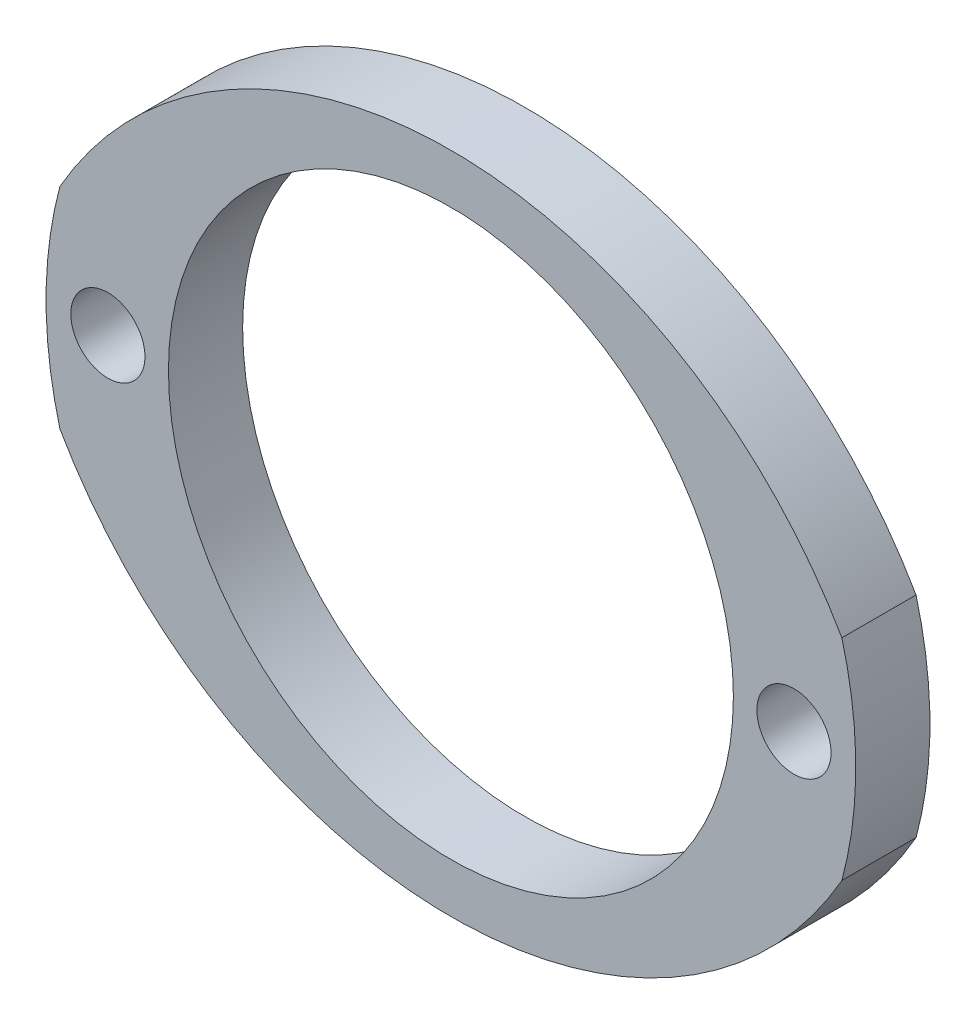
ISO-10303-21;
HEADER;
FILE_DESCRIPTION(('STEP AP214'),'2;1');
FILE_NAME('part.step','',(''),(''),'','','');
FILE_SCHEMA(('AUTOMOTIVE_DESIGN { 1 0 10303 214 1 1 1 1 }'));
ENDSEC;
DATA;
#1=APPLICATION_CONTEXT('core data for automotive mechanical design processes');
#2=APPLICATION_PROTOCOL_DEFINITION('international standard','automotive_design',2000,#1);
#3=PRODUCT_CONTEXT('',#1,'mechanical');
#4=PRODUCT('Part','Part','',(#3));
#5=PRODUCT_RELATED_PRODUCT_CATEGORY('part','',(#4));
#6=PRODUCT_DEFINITION_FORMATION('','',#4);
#7=PRODUCT_DEFINITION_CONTEXT('part definition',#1,'design');
#8=PRODUCT_DEFINITION('design','',#6,#7);
#9=PRODUCT_DEFINITION_SHAPE('','',#8);
#10=(LENGTH_UNIT() NAMED_UNIT(*) SI_UNIT(.MILLI.,.METRE.));
#11=(NAMED_UNIT(*) PLANE_ANGLE_UNIT() SI_UNIT($,.RADIAN.));
#12=(NAMED_UNIT(*) SI_UNIT($,.STERADIAN.) SOLID_ANGLE_UNIT());
#13=UNCERTAINTY_MEASURE_WITH_UNIT(LENGTH_MEASURE(1.E-05),#10,'distance_accuracy_value','');
#14=(GEOMETRIC_REPRESENTATION_CONTEXT(3) GLOBAL_UNCERTAINTY_ASSIGNED_CONTEXT((#13)) GLOBAL_UNIT_ASSIGNED_CONTEXT((#10,
#11,#12)) REPRESENTATION_CONTEXT('',''));
#15=CARTESIAN_POINT('',(0.,0.,0.));
#16=DIRECTION('',(0.,0.,1.));
#17=DIRECTION('',(1.,0.,0.));
#18=AXIS2_PLACEMENT_3D('',#15,#16,#17);
#19=CARTESIAN_POINT('',(-86.749230254648,395.375831785521,3.));
#20=DIRECTION('',(0.,0.,1.));
#21=DIRECTION('',(1.,0.,0.));
#22=AXIS2_PLACEMENT_3D('',#19,#20,#21);
#23=PLANE('',#22);
#24=CARTESIAN_POINT('',(-100.624230254648,397.771231861327,3.));
#25=DIRECTION('',(0.,0.,1.));
#26=DIRECTION('',(1.,0.,0.));
#27=AXIS2_PLACEMENT_3D('',#24,#25,#26);
#28=CIRCLE('',#27,1.5);
#29=CARTESIAN_POINT('',(-99.1242302546479,397.771231861327,3.));
#30=VERTEX_POINT('',#29);
#31=EDGE_CURVE('E134',#30,#30,#28,.T.);
#32=ORIENTED_EDGE('',*,*,#31,.F.);
#33=EDGE_LOOP('',(#32));
#34=FACE_BOUND('',#33,.T.);
#35=CARTESIAN_POINT('',(-86.749230254648,392.980431709715,3.));
#36=DIRECTION('',(0.,0.,1.));
#37=DIRECTION('',(1.,0.,0.));
#38=AXIS2_PLACEMENT_3D('',#35,#36,#37);
#39=CIRCLE('',#38,18.2158001516126);
#40=CARTESIAN_POINT('',(-70.935404793403,402.021355304391,3.));
#41=VERTEX_POINT('',#40);
#42=CARTESIAN_POINT('',(-102.563055715893,402.021355304391,3.));
#43=VERTEX_POINT('',#42);
#44=EDGE_CURVE('E89',#41,#43,#39,.T.);
#45=ORIENTED_EDGE('',*,*,#44,.T.);
#46=CARTESIAN_POINT('',(-86.749230254648,397.771231861327,3.));
#47=DIRECTION('',(0.,0.,1.));
#48=DIRECTION('',(1.,0.,0.));
#49=AXIS2_PLACEMENT_3D('',#46,#47,#48);
#50=CIRCLE('',#49,16.375);
#51=CARTESIAN_POINT('',(-102.563055715893,393.521108418265,3.));
#52=VERTEX_POINT('',#51);
#53=EDGE_CURVE('E84',#43,#52,#50,.T.);
#54=ORIENTED_EDGE('',*,*,#53,.T.);
#55=CARTESIAN_POINT('',(-86.749230254648,402.56203201294,3.));
#56=DIRECTION('',(0.,0.,1.));
#57=DIRECTION('',(1.,0.,0.));
#58=AXIS2_PLACEMENT_3D('',#55,#56,#57);
#59=CIRCLE('',#58,18.2158001516126);
#60=CARTESIAN_POINT('',(-70.9354047934027,393.521108418265,3.));
#61=VERTEX_POINT('',#60);
#62=EDGE_CURVE('E87',#52,#61,#59,.T.);
#63=ORIENTED_EDGE('',*,*,#62,.T.);
#64=CARTESIAN_POINT('',(-86.749230254648,397.771231861327,3.));
#65=DIRECTION('',(0.,0.,1.));
#66=DIRECTION('',(1.,0.,0.));
#67=AXIS2_PLACEMENT_3D('',#64,#65,#66);
#68=CIRCLE('',#67,16.3749999999999);
#69=EDGE_CURVE('E54',#61,#41,#68,.T.);
#70=ORIENTED_EDGE('',*,*,#69,.T.);
#71=EDGE_LOOP('',(#45,#54,#63,#70));
#72=FACE_BOUND('',#71,.T.);
#73=CARTESIAN_POINT('',(-72.874230254648,397.771231861327,3.));
#74=DIRECTION('',(0.,0.,1.));
#75=DIRECTION('',(1.,0.,0.));
#76=AXIS2_PLACEMENT_3D('',#73,#74,#75);
#77=CIRCLE('',#76,1.5);
#78=CARTESIAN_POINT('',(-71.374230254648,397.771231861327,3.));
#79=VERTEX_POINT('',#78);
#80=EDGE_CURVE('E110',#79,#79,#77,.T.);
#81=ORIENTED_EDGE('',*,*,#80,.F.);
#82=EDGE_LOOP('',(#81));
#83=FACE_BOUND('',#82,.T.);
#84=CARTESIAN_POINT('',(-86.749230254648,397.771231861327,3.));
#85=DIRECTION('',(0.,0.,1.));
#86=DIRECTION('',(1.,0.,0.));
#87=AXIS2_PLACEMENT_3D('',#84,#85,#86);
#88=CIRCLE('',#87,11.425);
#89=CARTESIAN_POINT('',(-75.3242302546479,397.771231861327,3.));
#90=VERTEX_POINT('',#89);
#91=EDGE_CURVE('E142',#90,#90,#88,.T.);
#92=ORIENTED_EDGE('',*,*,#91,.F.);
#93=EDGE_LOOP('',(#92));
#94=FACE_BOUND('',#93,.T.);
#95=ADVANCED_FACE('F36',(#34,#72,#83,#94),#23,.T.);
#96=CARTESIAN_POINT('',(-86.749230254648,395.375831785521,0.));
#97=DIRECTION('',(0.,0.,1.));
#98=DIRECTION('',(1.,0.,0.));
#99=AXIS2_PLACEMENT_3D('',#96,#97,#98);
#100=PLANE('',#99);
#101=CARTESIAN_POINT('',(-86.749230254648,392.980431709715,0.));
#102=DIRECTION('',(0.,0.,1.));
#103=DIRECTION('',(1.,0.,0.));
#104=AXIS2_PLACEMENT_3D('',#101,#102,#103);
#105=CIRCLE('',#104,18.2158001516126);
#106=CARTESIAN_POINT('',(-70.935404793403,402.021355304391,0.));
#107=VERTEX_POINT('',#106);
#108=CARTESIAN_POINT('',(-102.563055715893,402.021355304391,0.));
#109=VERTEX_POINT('',#108);
#110=EDGE_CURVE('E106',#107,#109,#105,.T.);
#111=ORIENTED_EDGE('',*,*,#110,.F.);
#112=CARTESIAN_POINT('',(-86.749230254648,397.771231861327,0.));
#113=DIRECTION('',(0.,0.,1.));
#114=DIRECTION('',(1.,0.,0.));
#115=AXIS2_PLACEMENT_3D('',#112,#113,#114);
#116=CIRCLE('',#115,16.3749999999999);
#117=CARTESIAN_POINT('',(-70.9354047934027,393.521108418265,0.));
#118=VERTEX_POINT('',#117);
#119=EDGE_CURVE('E77',#118,#107,#116,.T.);
#120=ORIENTED_EDGE('',*,*,#119,.F.);
#121=CARTESIAN_POINT('',(-86.749230254648,402.56203201294,0.));
#122=DIRECTION('',(0.,0.,1.));
#123=DIRECTION('',(1.,0.,0.));
#124=AXIS2_PLACEMENT_3D('',#121,#122,#123);
#125=CIRCLE('',#124,18.2158001516126);
#126=CARTESIAN_POINT('',(-102.563055715893,393.521108418265,0.));
#127=VERTEX_POINT('',#126);
#128=EDGE_CURVE('E71',#127,#118,#125,.T.);
#129=ORIENTED_EDGE('',*,*,#128,.F.);
#130=CARTESIAN_POINT('',(-86.749230254648,397.771231861327,0.));
#131=DIRECTION('',(0.,0.,1.));
#132=DIRECTION('',(1.,0.,0.));
#133=AXIS2_PLACEMENT_3D('',#130,#131,#132);
#134=CIRCLE('',#133,16.375);
#135=EDGE_CURVE('E94',#109,#127,#134,.T.);
#136=ORIENTED_EDGE('',*,*,#135,.F.);
#137=EDGE_LOOP('',(#111,#120,#129,#136));
#138=FACE_BOUND('',#137,.T.);
#139=CARTESIAN_POINT('',(-72.874230254648,397.771231861327,0.));
#140=DIRECTION('',(0.,0.,1.));
#141=DIRECTION('',(1.,0.,0.));
#142=AXIS2_PLACEMENT_3D('',#139,#140,#141);
#143=CIRCLE('',#142,1.5);
#144=CARTESIAN_POINT('',(-71.374230254648,397.771231861327,0.));
#145=VERTEX_POINT('',#144);
#146=EDGE_CURVE('E130',#145,#145,#143,.T.);
#147=ORIENTED_EDGE('',*,*,#146,.T.);
#148=EDGE_LOOP('',(#147));
#149=FACE_BOUND('',#148,.T.);
#150=CARTESIAN_POINT('',(-100.624230254648,397.771231861327,0.));
#151=DIRECTION('',(0.,0.,1.));
#152=DIRECTION('',(1.,0.,0.));
#153=AXIS2_PLACEMENT_3D('',#150,#151,#152);
#154=CIRCLE('',#153,1.5);
#155=CARTESIAN_POINT('',(-99.1242302546479,397.771231861327,0.));
#156=VERTEX_POINT('',#155);
#157=EDGE_CURVE('E138',#156,#156,#154,.T.);
#158=ORIENTED_EDGE('',*,*,#157,.T.);
#159=EDGE_LOOP('',(#158));
#160=FACE_BOUND('',#159,.T.);
#161=CARTESIAN_POINT('',(-86.749230254648,397.771231861327,0.));
#162=DIRECTION('',(0.,0.,1.));
#163=DIRECTION('',(1.,0.,0.));
#164=AXIS2_PLACEMENT_3D('',#161,#162,#163);
#165=CIRCLE('',#164,11.425);
#166=CARTESIAN_POINT('',(-75.3242302546479,397.771231861327,0.));
#167=VERTEX_POINT('',#166);
#168=EDGE_CURVE('E146',#167,#167,#165,.T.);
#169=ORIENTED_EDGE('',*,*,#168,.T.);
#170=EDGE_LOOP('',(#169));
#171=FACE_BOUND('',#170,.T.);
#172=ADVANCED_FACE('F124',(#138,#149,#160,#171),#100,.F.);
#173=CARTESIAN_POINT('',(-86.749230254648,392.980431709715,3.));
#174=DIRECTION('',(0.,0.,-1.));
#175=DIRECTION('',(-1.,0.,0.));
#176=AXIS2_PLACEMENT_3D('',#173,#174,#175);
#177=CYLINDRICAL_SURFACE('',#176,18.2158001516126);
#178=ORIENTED_EDGE('',*,*,#110,.T.);
#179=DIRECTION('',(0.,0.,-1.));
#180=VECTOR('',#179,1.);
#181=CARTESIAN_POINT('',(-102.563055715893,402.021355304391,3.));
#182=LINE('',#181,#180);
#183=EDGE_CURVE('E11',#43,#109,#182,.T.);
#184=ORIENTED_EDGE('',*,*,#183,.F.);
#185=ORIENTED_EDGE('',*,*,#44,.F.);
#186=DIRECTION('',(0.,0.,-1.));
#187=VECTOR('',#186,1.);
#188=CARTESIAN_POINT('',(-70.935404793403,402.021355304391,3.));
#189=LINE('',#188,#187);
#190=EDGE_CURVE('E102',#41,#107,#189,.T.);
#191=ORIENTED_EDGE('',*,*,#190,.T.);
#192=EDGE_LOOP('',(#178,#184,#185,#191));
#193=FACE_BOUND('',#192,.T.);
#194=ADVANCED_FACE('F38',(#193),#177,.T.);
#195=CARTESIAN_POINT('',(-86.749230254648,397.771231861327,3.));
#196=DIRECTION('',(0.,0.,-1.));
#197=DIRECTION('',(-1.,0.,0.));
#198=AXIS2_PLACEMENT_3D('',#195,#196,#197);
#199=CYLINDRICAL_SURFACE('',#198,16.375);
#200=ORIENTED_EDGE('',*,*,#135,.T.);
#201=DIRECTION('',(0.,0.,-1.));
#202=VECTOR('',#201,1.);
#203=CARTESIAN_POINT('',(-102.563055715893,393.521108418265,3.));
#204=LINE('',#203,#202);
#205=EDGE_CURVE('E46',#52,#127,#204,.T.);
#206=ORIENTED_EDGE('',*,*,#205,.F.);
#207=ORIENTED_EDGE('',*,*,#53,.F.);
#208=ORIENTED_EDGE('',*,*,#183,.T.);
#209=EDGE_LOOP('',(#200,#206,#207,#208));
#210=FACE_BOUND('',#209,.T.);
#211=ADVANCED_FACE('F93',(#210),#199,.T.);
#212=CARTESIAN_POINT('',(-86.749230254648,402.56203201294,3.));
#213=DIRECTION('',(0.,0.,-1.));
#214=DIRECTION('',(-1.,0.,0.));
#215=AXIS2_PLACEMENT_3D('',#212,#213,#214);
#216=CYLINDRICAL_SURFACE('',#215,18.2158001516126);
#217=ORIENTED_EDGE('',*,*,#128,.T.);
#218=DIRECTION('',(0.,0.,-1.));
#219=VECTOR('',#218,1.);
#220=CARTESIAN_POINT('',(-70.9354047934027,393.521108418265,3.));
#221=LINE('',#220,#219);
#222=EDGE_CURVE('E96',#61,#118,#221,.T.);
#223=ORIENTED_EDGE('',*,*,#222,.F.);
#224=ORIENTED_EDGE('',*,*,#62,.F.);
#225=ORIENTED_EDGE('',*,*,#205,.T.);
#226=EDGE_LOOP('',(#217,#223,#224,#225));
#227=FACE_BOUND('',#226,.T.);
#228=ADVANCED_FACE('F97',(#227),#216,.T.);
#229=CARTESIAN_POINT('',(-86.749230254648,397.771231861327,3.));
#230=DIRECTION('',(0.,0.,-1.));
#231=DIRECTION('',(-1.,0.,0.));
#232=AXIS2_PLACEMENT_3D('',#229,#230,#231);
#233=CYLINDRICAL_SURFACE('',#232,16.3749999999999);
#234=ORIENTED_EDGE('',*,*,#119,.T.);
#235=ORIENTED_EDGE('',*,*,#190,.F.);
#236=ORIENTED_EDGE('',*,*,#69,.F.);
#237=ORIENTED_EDGE('',*,*,#222,.T.);
#238=EDGE_LOOP('',(#234,#235,#236,#237));
#239=FACE_BOUND('',#238,.T.);
#240=ADVANCED_FACE('F121',(#239),#233,.T.);
#241=CARTESIAN_POINT('',(-72.874230254648,397.771231861327,3.));
#242=DIRECTION('',(0.,0.,-1.));
#243=DIRECTION('',(-1.,0.,0.));
#244=AXIS2_PLACEMENT_3D('',#241,#242,#243);
#245=CYLINDRICAL_SURFACE('',#244,1.5);
#246=ORIENTED_EDGE('',*,*,#80,.T.);
#247=EDGE_LOOP('',(#246));
#248=FACE_BOUND('',#247,.T.);
#249=ORIENTED_EDGE('',*,*,#146,.F.);
#250=EDGE_LOOP('',(#249));
#251=FACE_BOUND('',#250,.T.);
#252=ADVANCED_FACE('F167',(#248,#251),#245,.F.);
#253=CARTESIAN_POINT('',(-100.624230254648,397.771231861327,3.));
#254=DIRECTION('',(0.,0.,-1.));
#255=DIRECTION('',(-1.,0.,0.));
#256=AXIS2_PLACEMENT_3D('',#253,#254,#255);
#257=CYLINDRICAL_SURFACE('',#256,1.5);
#258=ORIENTED_EDGE('',*,*,#31,.T.);
#259=EDGE_LOOP('',(#258));
#260=FACE_BOUND('',#259,.T.);
#261=ORIENTED_EDGE('',*,*,#157,.F.);
#262=EDGE_LOOP('',(#261));
#263=FACE_BOUND('',#262,.T.);
#264=ADVANCED_FACE('F222',(#260,#263),#257,.F.);
#265=CARTESIAN_POINT('',(-86.749230254648,397.771231861327,3.));
#266=DIRECTION('',(0.,0.,-1.));
#267=DIRECTION('',(-1.,0.,0.));
#268=AXIS2_PLACEMENT_3D('',#265,#266,#267);
#269=CYLINDRICAL_SURFACE('',#268,11.425);
#270=ORIENTED_EDGE('',*,*,#91,.T.);
#271=EDGE_LOOP('',(#270));
#272=FACE_BOUND('',#271,.T.);
#273=ORIENTED_EDGE('',*,*,#168,.F.);
#274=EDGE_LOOP('',(#273));
#275=FACE_BOUND('',#274,.T.);
#276=ADVANCED_FACE('F155',(#272,#275),#269,.F.);
#277=CLOSED_SHELL('',(#95,#172,#194,#211,#228,#240,#252,#264,#276));
#278=MANIFOLD_SOLID_BREP('B2',#277);
#279=ADVANCED_BREP_SHAPE_REPRESENTATION('',(#18,#278),#14);
#280=SHAPE_DEFINITION_REPRESENTATION(#9,#279);
ENDSEC;
END-ISO-10303-21;
